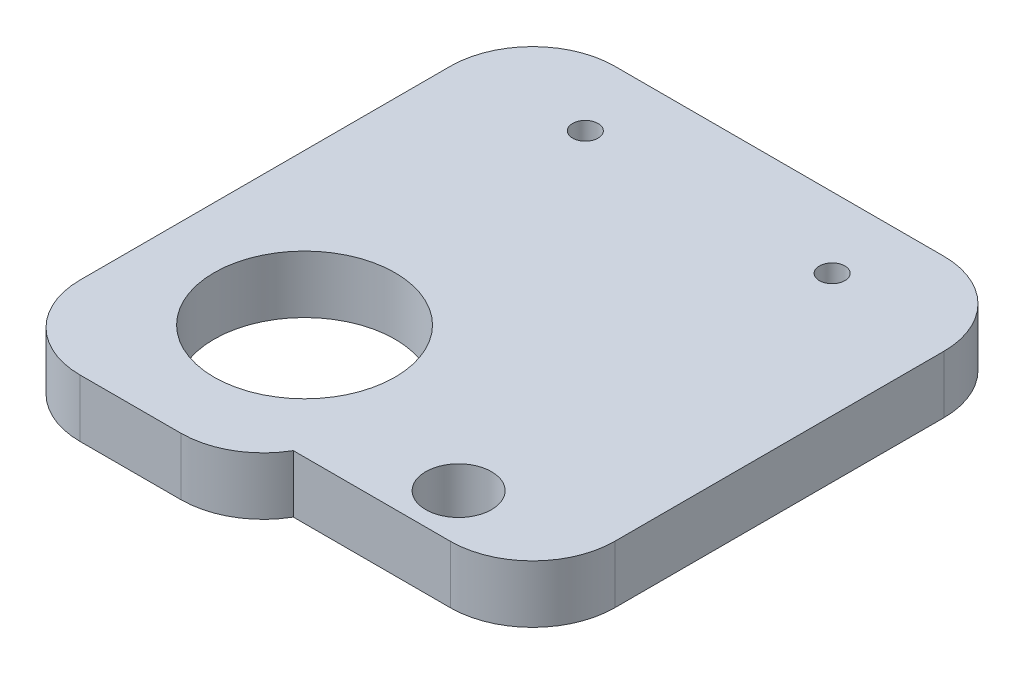
ISO-10303-21;
HEADER;
FILE_DESCRIPTION(('STEP AP214'),'2;1');
FILE_NAME('part.step','',(''),(''),'','','');
FILE_SCHEMA(('AUTOMOTIVE_DESIGN { 1 0 10303 214 1 1 1 1 }'));
ENDSEC;
DATA;
#1=APPLICATION_CONTEXT('core data for automotive mechanical design processes');
#2=APPLICATION_PROTOCOL_DEFINITION('international standard','automotive_design',2000,#1);
#3=PRODUCT_CONTEXT('',#1,'mechanical');
#4=PRODUCT('Part','Part','',(#3));
#5=PRODUCT_RELATED_PRODUCT_CATEGORY('part','',(#4));
#6=PRODUCT_DEFINITION_FORMATION('','',#4);
#7=PRODUCT_DEFINITION_CONTEXT('part definition',#1,'design');
#8=PRODUCT_DEFINITION('design','',#6,#7);
#9=PRODUCT_DEFINITION_SHAPE('','',#8);
#10=(LENGTH_UNIT() NAMED_UNIT(*) SI_UNIT(.MILLI.,.METRE.));
#11=(NAMED_UNIT(*) PLANE_ANGLE_UNIT() SI_UNIT($,.RADIAN.));
#12=(NAMED_UNIT(*) SI_UNIT($,.STERADIAN.) SOLID_ANGLE_UNIT());
#13=UNCERTAINTY_MEASURE_WITH_UNIT(LENGTH_MEASURE(1.E-05),#10,'distance_accuracy_value','');
#14=(GEOMETRIC_REPRESENTATION_CONTEXT(3) GLOBAL_UNCERTAINTY_ASSIGNED_CONTEXT((#13)) GLOBAL_UNIT_ASSIGNED_CONTEXT((#10,
#11,#12)) REPRESENTATION_CONTEXT('',''));
#15=CARTESIAN_POINT('',(0.,0.,0.));
#16=DIRECTION('',(0.,0.,1.));
#17=DIRECTION('',(1.,0.,0.));
#18=AXIS2_PLACEMENT_3D('',#15,#16,#17);
#19=CARTESIAN_POINT('',(-25.5,7.,53.4375));
#20=DIRECTION('',(0.,0.,-1.));
#21=DIRECTION('',(-1.,0.,0.));
#22=AXIS2_PLACEMENT_3D('',#19,#20,#21);
#23=PLANE('',#22);
#24=DIRECTION('',(0.,1.,0.));
#25=VECTOR('',#24,1.);
#26=CARTESIAN_POINT('',(5.41835897044862,0.,53.4375));
#27=LINE('',#26,#25);
#28=CARTESIAN_POINT('',(5.41835897044862,0.,53.4375));
#29=VERTEX_POINT('',#28);
#30=CARTESIAN_POINT('',(5.41835897044862,7.,53.4375));
#31=VERTEX_POINT('',#30);
#32=EDGE_CURVE('E125',#29,#31,#27,.T.);
#33=ORIENTED_EDGE('',*,*,#32,.F.);
#34=DIRECTION('',(1.,0.,0.));
#35=VECTOR('',#34,1.);
#36=CARTESIAN_POINT('',(-25.5,0.,53.4375));
#37=LINE('',#36,#35);
#38=CARTESIAN_POINT('',(24.5,0.,53.4375));
#39=VERTEX_POINT('',#38);
#40=EDGE_CURVE('E110',#29,#39,#37,.T.);
#41=ORIENTED_EDGE('',*,*,#40,.T.);
#42=DIRECTION('',(0.,-1.,0.));
#43=VECTOR('',#42,1.);
#44=CARTESIAN_POINT('',(24.5,7.,53.4375));
#45=LINE('',#44,#43);
#46=CARTESIAN_POINT('',(24.5,7.,53.4375));
#47=VERTEX_POINT('',#46);
#48=EDGE_CURVE('E158',#39,#47,#45,.F.);
#49=ORIENTED_EDGE('',*,*,#48,.T.);
#50=DIRECTION('',(1.,0.,0.));
#51=VECTOR('',#50,1.);
#52=CARTESIAN_POINT('',(-25.5,7.,53.4375));
#53=LINE('',#52,#51);
#54=EDGE_CURVE('E126',#31,#47,#53,.T.);
#55=ORIENTED_EDGE('',*,*,#54,.F.);
#56=EDGE_LOOP('',(#33,#41,#49,#55));
#57=FACE_BOUND('',#56,.T.);
#58=ADVANCED_FACE('F35',(#57),#23,.F.);
#59=CARTESIAN_POINT('',(-25.5,7.,-6.56249999999995));
#60=DIRECTION('',(1.,0.,0.));
#61=DIRECTION('',(0.,0.,-1.));
#62=AXIS2_PLACEMENT_3D('',#59,#60,#61);
#63=PLANE('',#62);
#64=DIRECTION('',(0.,0.,1.));
#65=VECTOR('',#64,1.);
#66=CARTESIAN_POINT('',(-25.5,0.,-6.56249999999995));
#67=LINE('',#66,#65);
#68=CARTESIAN_POINT('',(-25.5,0.,3.43750000000004));
#69=VERTEX_POINT('',#68);
#70=CARTESIAN_POINT('',(-25.5,0.,48.4375));
#71=VERTEX_POINT('',#70);
#72=EDGE_CURVE('E121',#69,#71,#67,.T.);
#73=ORIENTED_EDGE('',*,*,#72,.T.);
#74=DIRECTION('',(0.,-1.,0.));
#75=VECTOR('',#74,1.);
#76=CARTESIAN_POINT('',(-25.5,7.,48.4375));
#77=LINE('',#76,#75);
#78=CARTESIAN_POINT('',(-25.5,7.,48.4375));
#79=VERTEX_POINT('',#78);
#80=EDGE_CURVE('E11',#71,#79,#77,.F.);
#81=ORIENTED_EDGE('',*,*,#80,.T.);
#82=DIRECTION('',(0.,0.,1.));
#83=VECTOR('',#82,1.);
#84=CARTESIAN_POINT('',(-25.5,7.,-6.56249999999995));
#85=LINE('',#84,#83);
#86=CARTESIAN_POINT('',(-25.5,7.,3.43750000000004));
#87=VERTEX_POINT('',#86);
#88=EDGE_CURVE('E174',#87,#79,#85,.T.);
#89=ORIENTED_EDGE('',*,*,#88,.F.);
#90=DIRECTION('',(0.,-1.,0.));
#91=VECTOR('',#90,1.);
#92=CARTESIAN_POINT('',(-25.5,7.,3.43750000000004));
#93=LINE('',#92,#91);
#94=EDGE_CURVE('E144',#87,#69,#93,.T.);
#95=ORIENTED_EDGE('',*,*,#94,.T.);
#96=EDGE_LOOP('',(#73,#81,#89,#95));
#97=FACE_BOUND('',#96,.T.);
#98=ADVANCED_FACE('F222',(#97),#63,.F.);
#99=CARTESIAN_POINT('',(34.5,7.,-6.56249999999995));
#100=DIRECTION('',(-1.,0.,0.));
#101=DIRECTION('',(0.,0.,1.));
#102=AXIS2_PLACEMENT_3D('',#99,#100,#101);
#103=PLANE('',#102);
#104=DIRECTION('',(0.,0.,-1.));
#105=VECTOR('',#104,1.);
#106=CARTESIAN_POINT('',(34.5,7.,-6.56249999999995));
#107=LINE('',#106,#105);
#108=CARTESIAN_POINT('',(34.5,7.,43.4375));
#109=VERTEX_POINT('',#108);
#110=CARTESIAN_POINT('',(34.5,7.,3.43750000000004));
#111=VERTEX_POINT('',#110);
#112=EDGE_CURVE('E181',#109,#111,#107,.T.);
#113=ORIENTED_EDGE('',*,*,#112,.F.);
#114=DIRECTION('',(0.,-1.,0.));
#115=VECTOR('',#114,1.);
#116=CARTESIAN_POINT('',(34.5,7.,43.4375));
#117=LINE('',#116,#115);
#118=CARTESIAN_POINT('',(34.5,0.,43.4375));
#119=VERTEX_POINT('',#118);
#120=EDGE_CURVE('E165',#109,#119,#117,.T.);
#121=ORIENTED_EDGE('',*,*,#120,.T.);
#122=DIRECTION('',(0.,0.,-1.));
#123=VECTOR('',#122,1.);
#124=CARTESIAN_POINT('',(34.5,0.,-6.56249999999995));
#125=LINE('',#124,#123);
#126=CARTESIAN_POINT('',(34.5,0.,3.43750000000004));
#127=VERTEX_POINT('',#126);
#128=EDGE_CURVE('E120',#119,#127,#125,.T.);
#129=ORIENTED_EDGE('',*,*,#128,.T.);
#130=DIRECTION('',(0.,-1.,0.));
#131=VECTOR('',#130,1.);
#132=CARTESIAN_POINT('',(34.5,7.,3.43750000000004));
#133=LINE('',#132,#131);
#134=EDGE_CURVE('E168',#127,#111,#133,.F.);
#135=ORIENTED_EDGE('',*,*,#134,.T.);
#136=EDGE_LOOP('',(#113,#121,#129,#135));
#137=FACE_BOUND('',#136,.T.);
#138=ADVANCED_FACE('F237',(#137),#103,.F.);
#139=CARTESIAN_POINT('',(-25.5,7.,-6.56249999999995));
#140=DIRECTION('',(0.,0.,1.));
#141=DIRECTION('',(1.,0.,0.));
#142=AXIS2_PLACEMENT_3D('',#139,#140,#141);
#143=PLANE('',#142);
#144=DIRECTION('',(-1.,0.,0.));
#145=VECTOR('',#144,1.);
#146=CARTESIAN_POINT('',(-25.5,7.,-6.56249999999995));
#147=LINE('',#146,#145);
#148=CARTESIAN_POINT('',(24.5,7.,-6.56249999999995));
#149=VERTEX_POINT('',#148);
#150=CARTESIAN_POINT('',(-15.5,7.,-6.56249999999995));
#151=VERTEX_POINT('',#150);
#152=EDGE_CURVE('E170',#149,#151,#147,.T.);
#153=ORIENTED_EDGE('',*,*,#152,.F.);
#154=DIRECTION('',(0.,-1.,0.));
#155=VECTOR('',#154,1.);
#156=CARTESIAN_POINT('',(24.5,7.,-6.56249999999995));
#157=LINE('',#156,#155);
#158=CARTESIAN_POINT('',(24.5,0.,-6.56249999999995));
#159=VERTEX_POINT('',#158);
#160=EDGE_CURVE('E147',#149,#159,#157,.T.);
#161=ORIENTED_EDGE('',*,*,#160,.T.);
#162=DIRECTION('',(-1.,0.,0.));
#163=VECTOR('',#162,1.);
#164=CARTESIAN_POINT('',(-25.5,0.,-6.56249999999995));
#165=LINE('',#164,#163);
#166=CARTESIAN_POINT('',(-15.5,0.,-6.56249999999995));
#167=VERTEX_POINT('',#166);
#168=EDGE_CURVE('E171',#159,#167,#165,.T.);
#169=ORIENTED_EDGE('',*,*,#168,.T.);
#170=DIRECTION('',(0.,-1.,0.));
#171=VECTOR('',#170,1.);
#172=CARTESIAN_POINT('',(-15.5,7.,-6.56249999999995));
#173=LINE('',#172,#171);
#174=EDGE_CURVE('E150',#167,#151,#173,.F.);
#175=ORIENTED_EDGE('',*,*,#174,.T.);
#176=EDGE_LOOP('',(#153,#161,#169,#175));
#177=FACE_BOUND('',#176,.T.);
#178=ADVANCED_FACE('F229',(#177),#143,.F.);
#179=CARTESIAN_POINT('',(0.,7.,0.));
#180=DIRECTION('',(0.,1.,0.));
#181=DIRECTION('',(0.,0.,1.));
#182=AXIS2_PLACEMENT_3D('',#179,#180,#181);
#183=PLANE('',#182);
#184=CARTESIAN_POINT('',(-10.5,7.,2.02453983183514));
#185=DIRECTION('',(0.,-1.,0.));
#186=DIRECTION('',(0.,0.,-1.));
#187=AXIS2_PLACEMENT_3D('',#184,#185,#186);
#188=CIRCLE('',#187,1.55);
#189=CARTESIAN_POINT('',(-10.5,7.,0.474539831835138));
#190=VERTEX_POINT('',#189);
#191=EDGE_CURVE('E190',#190,#190,#188,.T.);
#192=ORIENTED_EDGE('',*,*,#191,.T.);
#193=EDGE_LOOP('',(#192));
#194=FACE_BOUND('',#193,.T.);
#195=CARTESIAN_POINT('',(19.5,7.,2.02453983183514));
#196=DIRECTION('',(0.,-1.,0.));
#197=DIRECTION('',(0.,0.,-1.));
#198=AXIS2_PLACEMENT_3D('',#195,#196,#197);
#199=CIRCLE('',#198,1.55);
#200=CARTESIAN_POINT('',(19.5,7.,0.474539831835137));
#201=VERTEX_POINT('',#200);
#202=EDGE_CURVE('E201',#201,#201,#199,.T.);
#203=ORIENTED_EDGE('',*,*,#202,.T.);
#204=EDGE_LOOP('',(#203));
#205=FACE_BOUND('',#204,.T.);
#206=CARTESIAN_POINT('',(19.6799478211949,7.,47.6055964360555));
#207=DIRECTION('',(0.,-1.,0.));
#208=DIRECTION('',(0.,0.,-1.));
#209=AXIS2_PLACEMENT_3D('',#206,#207,#208);
#210=CIRCLE('',#209,4.00000000000001);
#211=CARTESIAN_POINT('',(19.6799478211949,7.,43.6055964360555));
#212=VERTEX_POINT('',#211);
#213=EDGE_CURVE('E178',#212,#212,#210,.T.);
#214=ORIENTED_EDGE('',*,*,#213,.T.);
#215=EDGE_LOOP('',(#214));
#216=FACE_BOUND('',#215,.T.);
#217=CARTESIAN_POINT('',(-7.12856806756959,7.,39.5245398318286));
#218=DIRECTION('',(0.,-1.,0.));
#219=DIRECTION('',(0.,0.,-1.));
#220=AXIS2_PLACEMENT_3D('',#217,#218,#219);
#221=CIRCLE('',#220,11.000000000088);
#222=CARTESIAN_POINT('',(-7.12856806756959,7.,28.5245398317406));
#223=VERTEX_POINT('',#222);
#224=EDGE_CURVE('E189',#223,#223,#221,.T.);
#225=ORIENTED_EDGE('',*,*,#224,.T.);
#226=EDGE_LOOP('',(#225));
#227=FACE_BOUND('',#226,.T.);
#228=DIRECTION('',(-1.,0.,0.));
#229=VECTOR('',#228,1.);
#230=CARTESIAN_POINT('',(5.41835897044862,7.,58.4375));
#231=LINE('',#230,#229);
#232=CARTESIAN_POINT('',(-3.24189506739576,7.,58.4375));
#233=VERTEX_POINT('',#232);
#234=CARTESIAN_POINT('',(-15.5,7.,58.4375));
#235=VERTEX_POINT('',#234);
#236=EDGE_CURVE('E202',#233,#235,#231,.T.);
#237=ORIENTED_EDGE('',*,*,#236,.F.);
#238=CARTESIAN_POINT('',(-3.24189506739576,7.,48.4375));
#239=DIRECTION('',(0.,1.,0.));
#240=DIRECTION('',(0.,0.,1.));
#241=AXIS2_PLACEMENT_3D('',#238,#239,#240);
#242=CIRCLE('',#241,10.);
#243=EDGE_CURVE('E134',#233,#31,#242,.T.);
#244=ORIENTED_EDGE('',*,*,#243,.T.);
#245=ORIENTED_EDGE('',*,*,#54,.T.);
#246=CARTESIAN_POINT('',(24.5,7.,43.4375));
#247=DIRECTION('',(0.,1.,0.));
#248=DIRECTION('',(0.,0.,1.));
#249=AXIS2_PLACEMENT_3D('',#246,#247,#248);
#250=CIRCLE('',#249,10.);
#251=EDGE_CURVE('E152',#47,#109,#250,.T.);
#252=ORIENTED_EDGE('',*,*,#251,.T.);
#253=ORIENTED_EDGE('',*,*,#112,.T.);
#254=CARTESIAN_POINT('',(24.5,7.,3.43750000000004));
#255=DIRECTION('',(0.,1.,0.));
#256=DIRECTION('',(0.,0.,1.));
#257=AXIS2_PLACEMENT_3D('',#254,#255,#256);
#258=CIRCLE('',#257,10.);
#259=EDGE_CURVE('E154',#111,#149,#258,.T.);
#260=ORIENTED_EDGE('',*,*,#259,.T.);
#261=ORIENTED_EDGE('',*,*,#152,.T.);
#262=CARTESIAN_POINT('',(-15.5,7.,3.43750000000004));
#263=DIRECTION('',(0.,1.,0.));
#264=DIRECTION('',(0.,0.,1.));
#265=AXIS2_PLACEMENT_3D('',#262,#263,#264);
#266=CIRCLE('',#265,10.);
#267=EDGE_CURVE('E156',#151,#87,#266,.T.);
#268=ORIENTED_EDGE('',*,*,#267,.T.);
#269=ORIENTED_EDGE('',*,*,#88,.T.);
#270=CARTESIAN_POINT('',(-15.5,7.,48.4375));
#271=DIRECTION('',(0.,1.,0.));
#272=DIRECTION('',(0.,0.,1.));
#273=AXIS2_PLACEMENT_3D('',#270,#271,#272);
#274=CIRCLE('',#273,10.);
#275=EDGE_CURVE('E138',#79,#235,#274,.T.);
#276=ORIENTED_EDGE('',*,*,#275,.T.);
#277=EDGE_LOOP('',(#237,#244,#245,#252,#253,#260,#261,#268,#269,#276));
#278=FACE_BOUND('',#277,.T.);
#279=ADVANCED_FACE('F219',(#194,#205,#216,#227,#278),#183,.T.);
#280=CARTESIAN_POINT('',(0.,0.,0.));
#281=DIRECTION('',(0.,1.,0.));
#282=DIRECTION('',(0.,0.,1.));
#283=AXIS2_PLACEMENT_3D('',#280,#281,#282);
#284=PLANE('',#283);
#285=CARTESIAN_POINT('',(-10.5,0.,2.02453983183514));
#286=DIRECTION('',(0.,-1.,0.));
#287=DIRECTION('',(0.,0.,-1.));
#288=AXIS2_PLACEMENT_3D('',#285,#286,#287);
#289=CIRCLE('',#288,1.55);
#290=CARTESIAN_POINT('',(-10.5,0.,0.474539831835138));
#291=VERTEX_POINT('',#290);
#292=EDGE_CURVE('E205',#291,#291,#289,.T.);
#293=ORIENTED_EDGE('',*,*,#292,.F.);
#294=EDGE_LOOP('',(#293));
#295=FACE_BOUND('',#294,.T.);
#296=CARTESIAN_POINT('',(19.5,0.,2.02453983183514));
#297=DIRECTION('',(0.,-1.,0.));
#298=DIRECTION('',(0.,0.,-1.));
#299=AXIS2_PLACEMENT_3D('',#296,#297,#298);
#300=CIRCLE('',#299,1.55);
#301=CARTESIAN_POINT('',(19.5,0.,0.474539831835137));
#302=VERTEX_POINT('',#301);
#303=EDGE_CURVE('E198',#302,#302,#300,.T.);
#304=ORIENTED_EDGE('',*,*,#303,.F.);
#305=EDGE_LOOP('',(#304));
#306=FACE_BOUND('',#305,.T.);
#307=CARTESIAN_POINT('',(19.6799478211949,0.,47.6055964360555));
#308=DIRECTION('',(0.,-1.,0.));
#309=DIRECTION('',(0.,0.,-1.));
#310=AXIS2_PLACEMENT_3D('',#307,#308,#309);
#311=CIRCLE('',#310,4.00000000000001);
#312=CARTESIAN_POINT('',(19.6799478211949,0.,43.6055964360555));
#313=VERTEX_POINT('',#312);
#314=EDGE_CURVE('E193',#313,#313,#311,.T.);
#315=ORIENTED_EDGE('',*,*,#314,.F.);
#316=EDGE_LOOP('',(#315));
#317=FACE_BOUND('',#316,.T.);
#318=CARTESIAN_POINT('',(-7.12856806756959,0.,39.5245398318286));
#319=DIRECTION('',(0.,-1.,0.));
#320=DIRECTION('',(0.,0.,-1.));
#321=AXIS2_PLACEMENT_3D('',#318,#319,#320);
#322=CIRCLE('',#321,11.000000000088);
#323=CARTESIAN_POINT('',(-7.12856806756959,0.,28.5245398317406));
#324=VERTEX_POINT('',#323);
#325=EDGE_CURVE('E186',#324,#324,#322,.T.);
#326=ORIENTED_EDGE('',*,*,#325,.F.);
#327=EDGE_LOOP('',(#326));
#328=FACE_BOUND('',#327,.T.);
#329=ORIENTED_EDGE('',*,*,#40,.F.);
#330=CARTESIAN_POINT('',(-3.24189506739576,0.,48.4375));
#331=DIRECTION('',(0.,1.,0.));
#332=DIRECTION('',(0.,0.,1.));
#333=AXIS2_PLACEMENT_3D('',#330,#331,#332);
#334=CIRCLE('',#333,10.);
#335=CARTESIAN_POINT('',(-3.24189506739576,0.,58.4375));
#336=VERTEX_POINT('',#335);
#337=EDGE_CURVE('E43',#29,#336,#334,.F.);
#338=ORIENTED_EDGE('',*,*,#337,.T.);
#339=DIRECTION('',(1.,0.,0.));
#340=VECTOR('',#339,1.);
#341=CARTESIAN_POINT('',(-25.5,0.,58.4375));
#342=LINE('',#341,#340);
#343=CARTESIAN_POINT('',(-15.5,0.,58.4375));
#344=VERTEX_POINT('',#343);
#345=EDGE_CURVE('E128',#344,#336,#342,.T.);
#346=ORIENTED_EDGE('',*,*,#345,.F.);
#347=CARTESIAN_POINT('',(-15.5,0.,48.4375));
#348=DIRECTION('',(0.,1.,0.));
#349=DIRECTION('',(0.,0.,1.));
#350=AXIS2_PLACEMENT_3D('',#347,#348,#349);
#351=CIRCLE('',#350,10.);
#352=EDGE_CURVE('E50',#344,#71,#351,.F.);
#353=ORIENTED_EDGE('',*,*,#352,.T.);
#354=ORIENTED_EDGE('',*,*,#72,.F.);
#355=CARTESIAN_POINT('',(-15.5,0.,3.43750000000004));
#356=DIRECTION('',(0.,1.,0.));
#357=DIRECTION('',(0.,0.,1.));
#358=AXIS2_PLACEMENT_3D('',#355,#356,#357);
#359=CIRCLE('',#358,10.);
#360=EDGE_CURVE('E163',#69,#167,#359,.F.);
#361=ORIENTED_EDGE('',*,*,#360,.T.);
#362=ORIENTED_EDGE('',*,*,#168,.F.);
#363=CARTESIAN_POINT('',(24.5,0.,3.43750000000004));
#364=DIRECTION('',(0.,1.,0.));
#365=DIRECTION('',(0.,0.,1.));
#366=AXIS2_PLACEMENT_3D('',#363,#364,#365);
#367=CIRCLE('',#366,10.);
#368=EDGE_CURVE('E161',#159,#127,#367,.F.);
#369=ORIENTED_EDGE('',*,*,#368,.T.);
#370=ORIENTED_EDGE('',*,*,#128,.F.);
#371=CARTESIAN_POINT('',(24.5,0.,43.4375));
#372=DIRECTION('',(0.,1.,0.));
#373=DIRECTION('',(0.,0.,1.));
#374=AXIS2_PLACEMENT_3D('',#371,#372,#373);
#375=CIRCLE('',#374,10.);
#376=EDGE_CURVE('E116',#119,#39,#375,.F.);
#377=ORIENTED_EDGE('',*,*,#376,.T.);
#378=EDGE_LOOP('',(#329,#338,#346,#353,#354,#361,#362,#369,#370,#377));
#379=FACE_BOUND('',#378,.T.);
#380=ADVANCED_FACE('F112',(#295,#306,#317,#328,#379),#284,.F.);
#381=CARTESIAN_POINT('',(-7.12856806756959,7.,39.5245398318286));
#382=DIRECTION('',(0.,-1.,0.));
#383=DIRECTION('',(0.,0.,-1.));
#384=AXIS2_PLACEMENT_3D('',#381,#382,#383);
#385=CYLINDRICAL_SURFACE('',#384,11.000000000088);
#386=ORIENTED_EDGE('',*,*,#224,.F.);
#387=EDGE_LOOP('',(#386));
#388=FACE_BOUND('',#387,.T.);
#389=ORIENTED_EDGE('',*,*,#325,.T.);
#390=EDGE_LOOP('',(#389));
#391=FACE_BOUND('',#390,.T.);
#392=ADVANCED_FACE('F266',(#388,#391),#385,.F.);
#393=CARTESIAN_POINT('',(19.6799478211949,7.,47.6055964360555));
#394=DIRECTION('',(0.,-1.,0.));
#395=DIRECTION('',(0.,0.,-1.));
#396=AXIS2_PLACEMENT_3D('',#393,#394,#395);
#397=CYLINDRICAL_SURFACE('',#396,4.00000000000001);
#398=ORIENTED_EDGE('',*,*,#213,.F.);
#399=EDGE_LOOP('',(#398));
#400=FACE_BOUND('',#399,.T.);
#401=ORIENTED_EDGE('',*,*,#314,.T.);
#402=EDGE_LOOP('',(#401));
#403=FACE_BOUND('',#402,.T.);
#404=ADVANCED_FACE('F273',(#400,#403),#397,.F.);
#405=CARTESIAN_POINT('',(19.5,7.,2.02453983183514));
#406=DIRECTION('',(0.,-1.,0.));
#407=DIRECTION('',(0.,0.,-1.));
#408=AXIS2_PLACEMENT_3D('',#405,#406,#407);
#409=CYLINDRICAL_SURFACE('',#408,1.55);
#410=ORIENTED_EDGE('',*,*,#202,.F.);
#411=EDGE_LOOP('',(#410));
#412=FACE_BOUND('',#411,.T.);
#413=ORIENTED_EDGE('',*,*,#303,.T.);
#414=EDGE_LOOP('',(#413));
#415=FACE_BOUND('',#414,.T.);
#416=ADVANCED_FACE('F250',(#412,#415),#409,.F.);
#417=CARTESIAN_POINT('',(-10.5,7.,2.02453983183514));
#418=DIRECTION('',(0.,-1.,0.));
#419=DIRECTION('',(0.,0.,-1.));
#420=AXIS2_PLACEMENT_3D('',#417,#418,#419);
#421=CYLINDRICAL_SURFACE('',#420,1.55);
#422=ORIENTED_EDGE('',*,*,#191,.F.);
#423=EDGE_LOOP('',(#422));
#424=FACE_BOUND('',#423,.T.);
#425=ORIENTED_EDGE('',*,*,#292,.T.);
#426=EDGE_LOOP('',(#425));
#427=FACE_BOUND('',#426,.T.);
#428=ADVANCED_FACE('F243',(#424,#427),#421,.F.);
#429=CARTESIAN_POINT('',(24.5,7.,43.4375));
#430=DIRECTION('',(0.,-1.,0.));
#431=DIRECTION('',(0.,0.,-1.));
#432=AXIS2_PLACEMENT_3D('',#429,#430,#431);
#433=CYLINDRICAL_SURFACE('',#432,10.);
#434=ORIENTED_EDGE('',*,*,#251,.F.);
#435=ORIENTED_EDGE('',*,*,#48,.F.);
#436=ORIENTED_EDGE('',*,*,#376,.F.);
#437=ORIENTED_EDGE('',*,*,#120,.F.);
#438=EDGE_LOOP('',(#434,#435,#436,#437));
#439=FACE_BOUND('',#438,.T.);
#440=ADVANCED_FACE('F241',(#439),#433,.T.);
#441=CARTESIAN_POINT('',(24.5,7.,3.43750000000004));
#442=DIRECTION('',(0.,-1.,0.));
#443=DIRECTION('',(0.,0.,-1.));
#444=AXIS2_PLACEMENT_3D('',#441,#442,#443);
#445=CYLINDRICAL_SURFACE('',#444,10.);
#446=ORIENTED_EDGE('',*,*,#259,.F.);
#447=ORIENTED_EDGE('',*,*,#134,.F.);
#448=ORIENTED_EDGE('',*,*,#368,.F.);
#449=ORIENTED_EDGE('',*,*,#160,.F.);
#450=EDGE_LOOP('',(#446,#447,#448,#449));
#451=FACE_BOUND('',#450,.T.);
#452=ADVANCED_FACE('F233',(#451),#445,.T.);
#453=CARTESIAN_POINT('',(-15.5,7.,3.43750000000004));
#454=DIRECTION('',(0.,-1.,0.));
#455=DIRECTION('',(0.,0.,-1.));
#456=AXIS2_PLACEMENT_3D('',#453,#454,#455);
#457=CYLINDRICAL_SURFACE('',#456,10.);
#458=ORIENTED_EDGE('',*,*,#267,.F.);
#459=ORIENTED_EDGE('',*,*,#174,.F.);
#460=ORIENTED_EDGE('',*,*,#360,.F.);
#461=ORIENTED_EDGE('',*,*,#94,.F.);
#462=EDGE_LOOP('',(#458,#459,#460,#461));
#463=FACE_BOUND('',#462,.T.);
#464=ADVANCED_FACE('F224',(#463),#457,.T.);
#465=CARTESIAN_POINT('',(0.,0.,58.4375));
#466=DIRECTION('',(0.,0.,1.));
#467=DIRECTION('',(1.,0.,0.));
#468=AXIS2_PLACEMENT_3D('',#465,#466,#467);
#469=PLANE('',#468);
#470=ORIENTED_EDGE('',*,*,#345,.T.);
#471=DIRECTION('',(0.,1.,0.));
#472=VECTOR('',#471,1.);
#473=CARTESIAN_POINT('',(-3.24189506739576,7.,58.4375));
#474=LINE('',#473,#472);
#475=EDGE_CURVE('E133',#336,#233,#474,.T.);
#476=ORIENTED_EDGE('',*,*,#475,.T.);
#477=ORIENTED_EDGE('',*,*,#236,.T.);
#478=DIRECTION('',(0.,-1.,0.));
#479=VECTOR('',#478,1.);
#480=CARTESIAN_POINT('',(-15.5,0.,58.4375));
#481=LINE('',#480,#479);
#482=EDGE_CURVE('E141',#235,#344,#481,.T.);
#483=ORIENTED_EDGE('',*,*,#482,.T.);
#484=EDGE_LOOP('',(#470,#476,#477,#483));
#485=FACE_BOUND('',#484,.T.);
#486=ADVANCED_FACE('F213',(#485),#469,.T.);
#487=CARTESIAN_POINT('',(-3.24189506739576,0.,48.4375));
#488=DIRECTION('',(0.,-1.,0.));
#489=DIRECTION('',(0.,0.,-1.));
#490=AXIS2_PLACEMENT_3D('',#487,#488,#489);
#491=CYLINDRICAL_SURFACE('',#490,10.);
#492=ORIENTED_EDGE('',*,*,#337,.F.);
#493=ORIENTED_EDGE('',*,*,#32,.T.);
#494=ORIENTED_EDGE('',*,*,#243,.F.);
#495=ORIENTED_EDGE('',*,*,#475,.F.);
#496=EDGE_LOOP('',(#492,#493,#494,#495));
#497=FACE_BOUND('',#496,.T.);
#498=ADVANCED_FACE('F131',(#497),#491,.T.);
#499=CARTESIAN_POINT('',(-15.5,0.,48.4375));
#500=DIRECTION('',(0.,1.,0.));
#501=DIRECTION('',(0.,0.,1.));
#502=AXIS2_PLACEMENT_3D('',#499,#500,#501);
#503=CYLINDRICAL_SURFACE('',#502,10.);
#504=ORIENTED_EDGE('',*,*,#275,.F.);
#505=ORIENTED_EDGE('',*,*,#80,.F.);
#506=ORIENTED_EDGE('',*,*,#352,.F.);
#507=ORIENTED_EDGE('',*,*,#482,.F.);
#508=EDGE_LOOP('',(#504,#505,#506,#507));
#509=FACE_BOUND('',#508,.T.);
#510=ADVANCED_FACE('F37',(#509),#503,.T.);
#511=CLOSED_SHELL('',(#58,#98,#138,#178,#279,#380,#392,#404,#416,#428,#440,#452,#464,#486,#498,#510));
#512=MANIFOLD_SOLID_BREP('B2',#511);
#513=ADVANCED_BREP_SHAPE_REPRESENTATION('',(#18,#512),#14);
#514=SHAPE_DEFINITION_REPRESENTATION(#9,#513);
ENDSEC;
END-ISO-10303-21;
